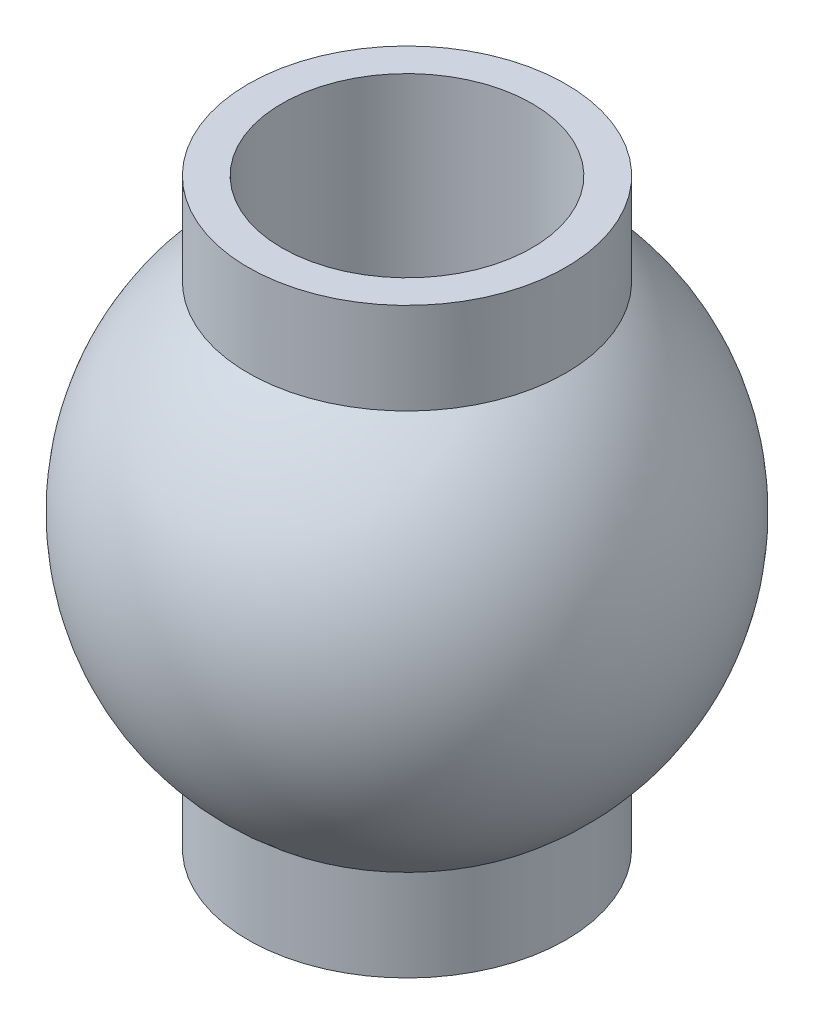
ISO-10303-21;
HEADER;
FILE_DESCRIPTION(('STEP AP214'),'2;1');
FILE_NAME('part.step','',(''),(''),'','','');
FILE_SCHEMA(('AUTOMOTIVE_DESIGN { 1 0 10303 214 1 1 1 1 }'));
ENDSEC;
DATA;
#1=APPLICATION_CONTEXT('core data for automotive mechanical design processes');
#2=APPLICATION_PROTOCOL_DEFINITION('international standard','automotive_design',2000,#1);
#3=PRODUCT_CONTEXT('',#1,'mechanical');
#4=PRODUCT('Part','Part','',(#3));
#5=PRODUCT_RELATED_PRODUCT_CATEGORY('part','',(#4));
#6=PRODUCT_DEFINITION_FORMATION('','',#4);
#7=PRODUCT_DEFINITION_CONTEXT('part definition',#1,'design');
#8=PRODUCT_DEFINITION('design','',#6,#7);
#9=PRODUCT_DEFINITION_SHAPE('','',#8);
#10=(LENGTH_UNIT() NAMED_UNIT(*) SI_UNIT(.MILLI.,.METRE.));
#11=(NAMED_UNIT(*) PLANE_ANGLE_UNIT() SI_UNIT($,.RADIAN.));
#12=(NAMED_UNIT(*) SI_UNIT($,.STERADIAN.) SOLID_ANGLE_UNIT());
#13=UNCERTAINTY_MEASURE_WITH_UNIT(LENGTH_MEASURE(1.E-05),#10,'distance_accuracy_value','');
#14=(GEOMETRIC_REPRESENTATION_CONTEXT(3) GLOBAL_UNCERTAINTY_ASSIGNED_CONTEXT((#13)) GLOBAL_UNIT_ASSIGNED_CONTEXT((#10,
#11,#12)) REPRESENTATION_CONTEXT('',''));
#15=CARTESIAN_POINT('',(0.,0.,0.));
#16=DIRECTION('',(0.,0.,1.));
#17=DIRECTION('',(1.,0.,0.));
#18=AXIS2_PLACEMENT_3D('',#15,#16,#17);
#19=CARTESIAN_POINT('',(0.,0.,0.));
#20=DIRECTION('',(1.,0.,0.));
#21=DIRECTION('',(0.,1.,0.));
#22=AXIS2_PLACEMENT_3D('',#19,#20,#21);
#23=SPHERICAL_SURFACE('',#22,3.0607);
#24=CARTESIAN_POINT('',(-3.0607,0.,0.));
#25=VERTEX_POINT('',#24);
#26=VERTEX_LOOP('',#25);
#27=FACE_BOUND('',#26,.T.);
#28=CARTESIAN_POINT('',(3.0607,0.,0.));
#29=VERTEX_POINT('',#28);
#30=VERTEX_LOOP('',#29);
#31=FACE_BOUND('',#30,.T.);
#32=CARTESIAN_POINT('',(0.,-2.39559167847945,0.));
#33=DIRECTION('',(0.,-1.,0.));
#34=DIRECTION('',(1.,0.,0.));
#35=AXIS2_PLACEMENT_3D('',#32,#33,#34);
#36=CIRCLE('',#35,1.905);
#37=CARTESIAN_POINT('',(1.905,-2.39559167847945,0.));
#38=VERTEX_POINT('',#37);
#39=EDGE_CURVE('E62',#38,#38,#36,.T.);
#40=ORIENTED_EDGE('',*,*,#39,.F.);
#41=EDGE_LOOP('',(#40));
#42=FACE_BOUND('',#41,.T.);
#43=CARTESIAN_POINT('',(0.,2.39559167847945,0.));
#44=DIRECTION('',(0.,1.,0.));
#45=DIRECTION('',(-1.,0.,0.));
#46=AXIS2_PLACEMENT_3D('',#43,#44,#45);
#47=CIRCLE('',#46,1.905);
#48=CARTESIAN_POINT('',(-1.905,2.39559167847945,0.));
#49=VERTEX_POINT('',#48);
#50=EDGE_CURVE('E50',#49,#49,#47,.T.);
#51=ORIENTED_EDGE('',*,*,#50,.F.);
#52=EDGE_LOOP('',(#51));
#53=FACE_BOUND('',#52,.T.);
#54=ADVANCED_FACE('F41',(#27,#31,#42,#53),#23,.T.);
#55=CARTESIAN_POINT('',(0.,3.4925,0.));
#56=DIRECTION('',(0.,-1.,0.));
#57=DIRECTION('',(1.,0.,0.));
#58=AXIS2_PLACEMENT_3D('',#55,#56,#57);
#59=CYLINDRICAL_SURFACE('',#58,1.905);
#60=CARTESIAN_POINT('',(0.,3.4925,0.));
#61=DIRECTION('',(0.,1.,0.));
#62=DIRECTION('',(-1.,0.,0.));
#63=AXIS2_PLACEMENT_3D('',#60,#61,#62);
#64=CIRCLE('',#63,1.905);
#65=CARTESIAN_POINT('',(-1.905,3.4925,0.));
#66=VERTEX_POINT('',#65);
#67=EDGE_CURVE('E12',#66,#66,#64,.T.);
#68=ORIENTED_EDGE('',*,*,#67,.F.);
#69=EDGE_LOOP('',(#68));
#70=FACE_BOUND('',#69,.T.);
#71=ORIENTED_EDGE('',*,*,#50,.T.);
#72=EDGE_LOOP('',(#71));
#73=FACE_BOUND('',#72,.T.);
#74=ADVANCED_FACE('F57',(#70,#73),#59,.T.);
#75=CARTESIAN_POINT('',(0.,3.4925,0.));
#76=DIRECTION('',(0.,1.,0.));
#77=DIRECTION('',(-1.,0.,0.));
#78=AXIS2_PLACEMENT_3D('',#75,#76,#77);
#79=PLANE('',#78);
#80=CARTESIAN_POINT('',(0.,3.4925,0.));
#81=DIRECTION('',(0.,-1.,0.));
#82=DIRECTION('',(0.,0.,-1.));
#83=AXIS2_PLACEMENT_3D('',#80,#81,#82);
#84=CIRCLE('',#83,1.49999999999999);
#85=CARTESIAN_POINT('',(0.,3.4925,-1.49999999999999));
#86=VERTEX_POINT('',#85);
#87=EDGE_CURVE('E76',#86,#86,#84,.T.);
#88=ORIENTED_EDGE('',*,*,#87,.T.);
#89=EDGE_LOOP('',(#88));
#90=FACE_BOUND('',#89,.T.);
#91=ORIENTED_EDGE('',*,*,#67,.T.);
#92=EDGE_LOOP('',(#91));
#93=FACE_BOUND('',#92,.T.);
#94=ADVANCED_FACE('F95',(#90,#93),#79,.T.);
#95=CARTESIAN_POINT('',(0.,-3.4925,0.));
#96=DIRECTION('',(0.,1.,0.));
#97=DIRECTION('',(-1.,0.,0.));
#98=AXIS2_PLACEMENT_3D('',#95,#96,#97);
#99=CYLINDRICAL_SURFACE('',#98,1.905);
#100=CARTESIAN_POINT('',(0.,-3.4925,0.));
#101=DIRECTION('',(0.,-1.,0.));
#102=DIRECTION('',(1.,0.,0.));
#103=AXIS2_PLACEMENT_3D('',#100,#101,#102);
#104=CIRCLE('',#103,1.905);
#105=CARTESIAN_POINT('',(1.905,-3.4925,0.));
#106=VERTEX_POINT('',#105);
#107=EDGE_CURVE('E67',#106,#106,#104,.T.);
#108=ORIENTED_EDGE('',*,*,#107,.F.);
#109=EDGE_LOOP('',(#108));
#110=FACE_BOUND('',#109,.T.);
#111=ORIENTED_EDGE('',*,*,#39,.T.);
#112=EDGE_LOOP('',(#111));
#113=FACE_BOUND('',#112,.T.);
#114=ADVANCED_FACE('F89',(#110,#113),#99,.T.);
#115=CARTESIAN_POINT('',(0.,-3.4925,0.));
#116=DIRECTION('',(0.,-1.,0.));
#117=DIRECTION('',(1.,0.,0.));
#118=AXIS2_PLACEMENT_3D('',#115,#116,#117);
#119=PLANE('',#118);
#120=CARTESIAN_POINT('',(0.,-3.4925,0.));
#121=DIRECTION('',(0.,-1.,0.));
#122=DIRECTION('',(0.,0.,-1.));
#123=AXIS2_PLACEMENT_3D('',#120,#121,#122);
#124=CIRCLE('',#123,1.49999999999999);
#125=CARTESIAN_POINT('',(0.,-3.4925,-1.49999999999999));
#126=VERTEX_POINT('',#125);
#127=EDGE_CURVE('E80',#126,#126,#124,.T.);
#128=ORIENTED_EDGE('',*,*,#127,.F.);
#129=EDGE_LOOP('',(#128));
#130=FACE_BOUND('',#129,.T.);
#131=ORIENTED_EDGE('',*,*,#107,.T.);
#132=EDGE_LOOP('',(#131));
#133=FACE_BOUND('',#132,.T.);
#134=ADVANCED_FACE('F86',(#130,#133),#119,.T.);
#135=CARTESIAN_POINT('',(0.,-3.4925,0.));
#136=DIRECTION('',(0.,-1.,0.));
#137=DIRECTION('',(0.,0.,-1.));
#138=AXIS2_PLACEMENT_3D('',#135,#136,#137);
#139=CYLINDRICAL_SURFACE('',#138,1.49999999999999);
#140=ORIENTED_EDGE('',*,*,#87,.F.);
#141=EDGE_LOOP('',(#140));
#142=FACE_BOUND('',#141,.T.);
#143=ORIENTED_EDGE('',*,*,#127,.T.);
#144=EDGE_LOOP('',(#143));
#145=FACE_BOUND('',#144,.T.);
#146=ADVANCED_FACE('F84',(#142,#145),#139,.F.);
#147=CLOSED_SHELL('',(#54,#74,#94,#114,#134,#146));
#148=MANIFOLD_SOLID_BREP('B2',#147);
#149=ADVANCED_BREP_SHAPE_REPRESENTATION('',(#18,#148),#14);
#150=SHAPE_DEFINITION_REPRESENTATION(#9,#149);
ENDSEC;
END-ISO-10303-21;
